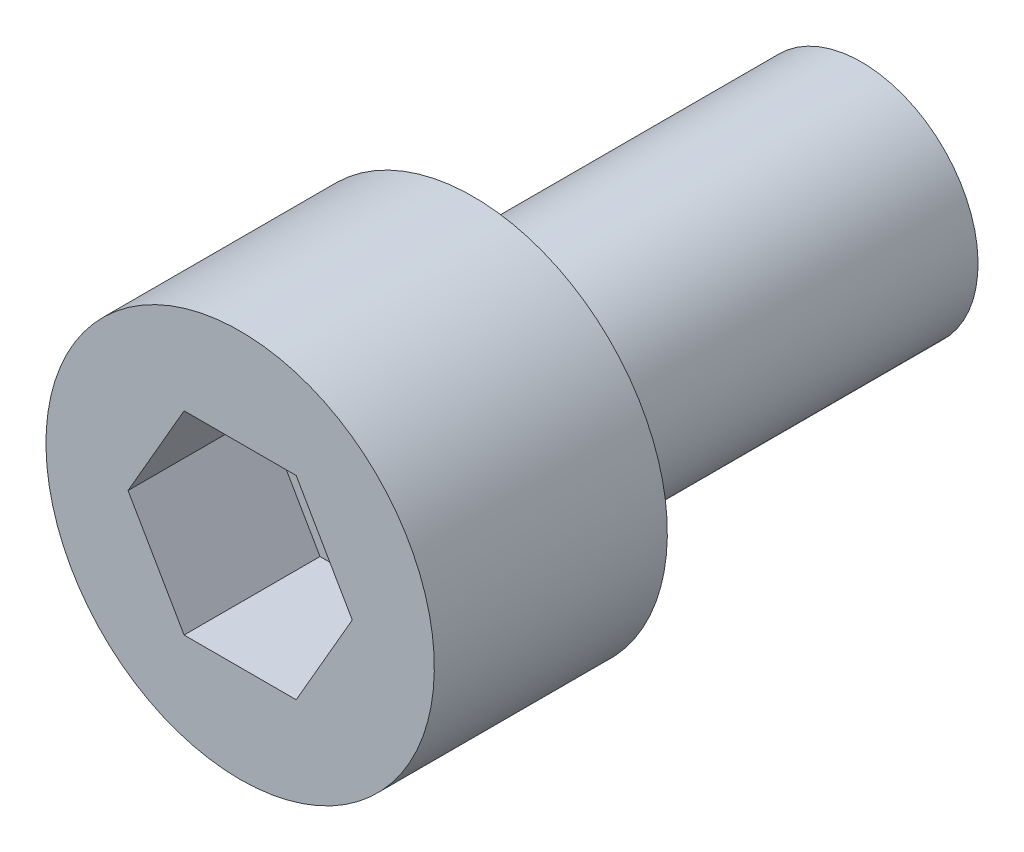
ISO-10303-21;
HEADER;
FILE_DESCRIPTION(('STEP AP214'),'2;1');
FILE_NAME('part.step','',(''),(''),'','','');
FILE_SCHEMA(('AUTOMOTIVE_DESIGN { 1 0 10303 214 1 1 1 1 }'));
ENDSEC;
DATA;
#1=APPLICATION_CONTEXT('core data for automotive mechanical design processes');
#2=APPLICATION_PROTOCOL_DEFINITION('international standard','automotive_design',2000,#1);
#3=PRODUCT_CONTEXT('',#1,'mechanical');
#4=PRODUCT('Part','Part','',(#3));
#5=PRODUCT_RELATED_PRODUCT_CATEGORY('part','',(#4));
#6=PRODUCT_DEFINITION_FORMATION('','',#4);
#7=PRODUCT_DEFINITION_CONTEXT('part definition',#1,'design');
#8=PRODUCT_DEFINITION('design','',#6,#7);
#9=PRODUCT_DEFINITION_SHAPE('','',#8);
#10=(LENGTH_UNIT() NAMED_UNIT(*) SI_UNIT(.MILLI.,.METRE.));
#11=(NAMED_UNIT(*) PLANE_ANGLE_UNIT() SI_UNIT($,.RADIAN.));
#12=(NAMED_UNIT(*) SI_UNIT($,.STERADIAN.) SOLID_ANGLE_UNIT());
#13=UNCERTAINTY_MEASURE_WITH_UNIT(LENGTH_MEASURE(1.E-05),#10,'distance_accuracy_value','');
#14=(GEOMETRIC_REPRESENTATION_CONTEXT(3) GLOBAL_UNCERTAINTY_ASSIGNED_CONTEXT((#13)) GLOBAL_UNIT_ASSIGNED_CONTEXT((#10,
#11,#12)) REPRESENTATION_CONTEXT('',''));
#15=CARTESIAN_POINT('',(0.,0.,0.));
#16=DIRECTION('',(0.,0.,1.));
#17=DIRECTION('',(1.,0.,0.));
#18=AXIS2_PLACEMENT_3D('',#15,#16,#17);
#19=CARTESIAN_POINT('',(0.,0.,6.));
#20=DIRECTION('',(0.,0.,-1.));
#21=DIRECTION('',(0.,1.,0.));
#22=AXIS2_PLACEMENT_3D('',#19,#20,#21);
#23=PLANE('',#22);
#24=DIRECTION('',(0.5,0.866025403784439,0.));
#25=VECTOR('',#24,1.);
#26=CARTESIAN_POINT('',(1.44337567297407,-2.5,6.));
#27=LINE('',#26,#25);
#28=CARTESIAN_POINT('',(1.44337567297407,-2.5,6.));
#29=VERTEX_POINT('',#28);
#30=CARTESIAN_POINT('',(2.88675134594813,0.,6.));
#31=VERTEX_POINT('',#30);
#32=EDGE_CURVE('E124',#29,#31,#27,.T.);
#33=ORIENTED_EDGE('',*,*,#32,.F.);
#34=DIRECTION('',(1.,0.,0.));
#35=VECTOR('',#34,1.);
#36=CARTESIAN_POINT('',(-1.44337567297406,-2.5,6.));
#37=LINE('',#36,#35);
#38=CARTESIAN_POINT('',(-1.44337567297406,-2.5,6.));
#39=VERTEX_POINT('',#38);
#40=EDGE_CURVE('E50',#39,#29,#37,.T.);
#41=ORIENTED_EDGE('',*,*,#40,.F.);
#42=DIRECTION('',(0.5,-0.866025403784439,0.));
#43=VECTOR('',#42,1.);
#44=CARTESIAN_POINT('',(-2.88675134594813,0.,6.));
#45=LINE('',#44,#43);
#46=CARTESIAN_POINT('',(-2.88675134594813,0.,6.));
#47=VERTEX_POINT('',#46);
#48=EDGE_CURVE('E133',#47,#39,#45,.T.);
#49=ORIENTED_EDGE('',*,*,#48,.F.);
#50=DIRECTION('',(-0.5,-0.866025403784439,0.));
#51=VECTOR('',#50,1.);
#52=CARTESIAN_POINT('',(-1.44337567297406,2.5,6.));
#53=LINE('',#52,#51);
#54=CARTESIAN_POINT('',(-1.44337567297406,2.5,6.));
#55=VERTEX_POINT('',#54);
#56=EDGE_CURVE('E131',#55,#47,#53,.T.);
#57=ORIENTED_EDGE('',*,*,#56,.F.);
#58=DIRECTION('',(-1.,0.,0.));
#59=VECTOR('',#58,1.);
#60=CARTESIAN_POINT('',(1.44337567297406,2.5,6.));
#61=LINE('',#60,#59);
#62=CARTESIAN_POINT('',(1.44337567297406,2.5,6.));
#63=VERTEX_POINT('',#62);
#64=EDGE_CURVE('E98',#63,#55,#61,.T.);
#65=ORIENTED_EDGE('',*,*,#64,.F.);
#66=DIRECTION('',(-0.5,0.866025403784439,0.));
#67=VECTOR('',#66,1.);
#68=CARTESIAN_POINT('',(2.88675134594813,0.,6.));
#69=LINE('',#68,#67);
#70=EDGE_CURVE('E127',#31,#63,#69,.T.);
#71=ORIENTED_EDGE('',*,*,#70,.F.);
#72=EDGE_LOOP('',(#33,#41,#49,#57,#65,#71));
#73=FACE_BOUND('',#72,.T.);
#74=CARTESIAN_POINT('',(0.,0.,6.));
#75=DIRECTION('',(0.,0.,1.));
#76=DIRECTION('',(0.,-1.,0.));
#77=AXIS2_PLACEMENT_3D('',#74,#75,#76);
#78=CIRCLE('',#77,5.);
#79=CARTESIAN_POINT('',(0.,-5.,6.));
#80=VERTEX_POINT('',#79);
#81=EDGE_CURVE('E11',#80,#80,#78,.T.);
#82=ORIENTED_EDGE('',*,*,#81,.T.);
#83=EDGE_LOOP('',(#82));
#84=FACE_BOUND('',#83,.T.);
#85=ADVANCED_FACE('F36',(#73,#84),#23,.F.);
#86=CARTESIAN_POINT('',(0.,0.,5.58488227818494));
#87=DIRECTION('',(0.,0.,1.));
#88=DIRECTION('',(0.,-1.,0.));
#89=AXIS2_PLACEMENT_3D('',#86,#87,#88);
#90=CYLINDRICAL_SURFACE('',#89,5.);
#91=ORIENTED_EDGE('',*,*,#81,.F.);
#92=EDGE_LOOP('',(#91));
#93=FACE_BOUND('',#92,.T.);
#94=CARTESIAN_POINT('',(0.,0.,0.));
#95=DIRECTION('',(0.,0.,1.));
#96=DIRECTION('',(0.,-1.,0.));
#97=AXIS2_PLACEMENT_3D('',#94,#95,#96);
#98=CIRCLE('',#97,5.);
#99=CARTESIAN_POINT('',(0.,-5.,0.));
#100=VERTEX_POINT('',#99);
#101=EDGE_CURVE('E43',#100,#100,#98,.T.);
#102=ORIENTED_EDGE('',*,*,#101,.T.);
#103=EDGE_LOOP('',(#102));
#104=FACE_BOUND('',#103,.T.);
#105=ADVANCED_FACE('F150',(#93,#104),#90,.T.);
#106=CARTESIAN_POINT('',(0.,5.,0.));
#107=DIRECTION('',(0.,0.,1.));
#108=DIRECTION('',(0.,-1.,0.));
#109=AXIS2_PLACEMENT_3D('',#106,#107,#108);
#110=PLANE('',#109);
#111=ORIENTED_EDGE('',*,*,#101,.F.);
#112=EDGE_LOOP('',(#111));
#113=FACE_BOUND('',#112,.T.);
#114=CARTESIAN_POINT('',(0.,0.,0.));
#115=DIRECTION('',(0.,0.,1.));
#116=DIRECTION('',(0.,-1.,0.));
#117=AXIS2_PLACEMENT_3D('',#114,#115,#116);
#118=CIRCLE('',#117,3.);
#119=CARTESIAN_POINT('',(0.,-3.,0.));
#120=VERTEX_POINT('',#119);
#121=EDGE_CURVE('E145',#120,#120,#118,.T.);
#122=ORIENTED_EDGE('',*,*,#121,.T.);
#123=EDGE_LOOP('',(#122));
#124=FACE_BOUND('',#123,.T.);
#125=ADVANCED_FACE('F152',(#113,#124),#110,.F.);
#126=CARTESIAN_POINT('',(0.,0.,5.58488227818494));
#127=DIRECTION('',(0.,0.,1.));
#128=DIRECTION('',(0.,-1.,0.));
#129=AXIS2_PLACEMENT_3D('',#126,#127,#128);
#130=CYLINDRICAL_SURFACE('',#129,3.);
#131=ORIENTED_EDGE('',*,*,#121,.F.);
#132=EDGE_LOOP('',(#131));
#133=FACE_BOUND('',#132,.T.);
#134=CARTESIAN_POINT('',(0.,0.,-10.));
#135=DIRECTION('',(0.,0.,1.));
#136=DIRECTION('',(0.,-1.,0.));
#137=AXIS2_PLACEMENT_3D('',#134,#135,#136);
#138=CIRCLE('',#137,3.);
#139=CARTESIAN_POINT('',(0.,-3.,-10.));
#140=VERTEX_POINT('',#139);
#141=EDGE_CURVE('E137',#140,#140,#138,.T.);
#142=ORIENTED_EDGE('',*,*,#141,.T.);
#143=EDGE_LOOP('',(#142));
#144=FACE_BOUND('',#143,.T.);
#145=ADVANCED_FACE('F155',(#133,#144),#130,.T.);
#146=CARTESIAN_POINT('',(0.,3.,-10.));
#147=DIRECTION('',(0.,0.,1.));
#148=DIRECTION('',(0.,-1.,0.));
#149=AXIS2_PLACEMENT_3D('',#146,#147,#148);
#150=PLANE('',#149);
#151=ORIENTED_EDGE('',*,*,#141,.F.);
#152=EDGE_LOOP('',(#151));
#153=FACE_BOUND('',#152,.T.);
#154=ADVANCED_FACE('F161',(#153),#150,.F.);
#155=CARTESIAN_POINT('',(-1.44337567297406,-2.5,2.5));
#156=DIRECTION('',(0.,-1.,0.));
#157=DIRECTION('',(1.,0.,0.));
#158=AXIS2_PLACEMENT_3D('',#155,#156,#157);
#159=PLANE('',#158);
#160=ORIENTED_EDGE('',*,*,#40,.T.);
#161=DIRECTION('',(0.,0.,1.));
#162=VECTOR('',#161,1.);
#163=CARTESIAN_POINT('',(1.44337567297407,-2.5,2.5));
#164=LINE('',#163,#162);
#165=CARTESIAN_POINT('',(1.44337567297407,-2.5,2.5));
#166=VERTEX_POINT('',#165);
#167=EDGE_CURVE('E80',#166,#29,#164,.T.);
#168=ORIENTED_EDGE('',*,*,#167,.F.);
#169=DIRECTION('',(1.,0.,0.));
#170=VECTOR('',#169,1.);
#171=CARTESIAN_POINT('',(-1.44337567297406,-2.5,2.5));
#172=LINE('',#171,#170);
#173=CARTESIAN_POINT('',(-1.44337567297406,-2.5,2.5));
#174=VERTEX_POINT('',#173);
#175=EDGE_CURVE('E135',#174,#166,#172,.T.);
#176=ORIENTED_EDGE('',*,*,#175,.F.);
#177=DIRECTION('',(0.,0.,1.));
#178=VECTOR('',#177,1.);
#179=CARTESIAN_POINT('',(-1.44337567297406,-2.5,2.5));
#180=LINE('',#179,#178);
#181=EDGE_CURVE('E58',#174,#39,#180,.T.);
#182=ORIENTED_EDGE('',*,*,#181,.T.);
#183=EDGE_LOOP('',(#160,#168,#176,#182));
#184=FACE_BOUND('',#183,.T.);
#185=ADVANCED_FACE('F166',(#184),#159,.F.);
#186=CARTESIAN_POINT('',(-2.88675134594813,0.,2.5));
#187=DIRECTION('',(-0.866025403784439,-0.5,0.));
#188=DIRECTION('',(0.5,-0.866025403784439,0.));
#189=AXIS2_PLACEMENT_3D('',#186,#187,#188);
#190=PLANE('',#189);
#191=ORIENTED_EDGE('',*,*,#48,.T.);
#192=ORIENTED_EDGE('',*,*,#181,.F.);
#193=DIRECTION('',(0.5,-0.866025403784439,0.));
#194=VECTOR('',#193,1.);
#195=CARTESIAN_POINT('',(-2.88675134594813,0.,2.5));
#196=LINE('',#195,#194);
#197=CARTESIAN_POINT('',(-2.88675134594813,0.,2.5));
#198=VERTEX_POINT('',#197);
#199=EDGE_CURVE('E110',#198,#174,#196,.T.);
#200=ORIENTED_EDGE('',*,*,#199,.F.);
#201=DIRECTION('',(0.,0.,1.));
#202=VECTOR('',#201,1.);
#203=CARTESIAN_POINT('',(-2.88675134594813,0.,2.5));
#204=LINE('',#203,#202);
#205=EDGE_CURVE('E102',#198,#47,#204,.T.);
#206=ORIENTED_EDGE('',*,*,#205,.T.);
#207=EDGE_LOOP('',(#191,#192,#200,#206));
#208=FACE_BOUND('',#207,.T.);
#209=ADVANCED_FACE('F171',(#208),#190,.F.);
#210=CARTESIAN_POINT('',(-1.44337567297406,2.5,2.5));
#211=DIRECTION('',(-0.866025403784439,0.5,0.));
#212=DIRECTION('',(-0.5,-0.866025403784439,0.));
#213=AXIS2_PLACEMENT_3D('',#210,#211,#212);
#214=PLANE('',#213);
#215=ORIENTED_EDGE('',*,*,#56,.T.);
#216=ORIENTED_EDGE('',*,*,#205,.F.);
#217=DIRECTION('',(-0.5,-0.866025403784439,0.));
#218=VECTOR('',#217,1.);
#219=CARTESIAN_POINT('',(-1.44337567297406,2.5,2.5));
#220=LINE('',#219,#218);
#221=CARTESIAN_POINT('',(-1.44337567297406,2.5,2.5));
#222=VERTEX_POINT('',#221);
#223=EDGE_CURVE('E106',#222,#198,#220,.T.);
#224=ORIENTED_EDGE('',*,*,#223,.F.);
#225=DIRECTION('',(0.,0.,1.));
#226=VECTOR('',#225,1.);
#227=CARTESIAN_POINT('',(-1.44337567297406,2.5,2.5));
#228=LINE('',#227,#226);
#229=EDGE_CURVE('E91',#222,#55,#228,.T.);
#230=ORIENTED_EDGE('',*,*,#229,.T.);
#231=EDGE_LOOP('',(#215,#216,#224,#230));
#232=FACE_BOUND('',#231,.T.);
#233=ADVANCED_FACE('F107',(#232),#214,.F.);
#234=CARTESIAN_POINT('',(1.44337567297406,2.5,2.5));
#235=DIRECTION('',(0.,1.,0.));
#236=DIRECTION('',(0.,0.,1.));
#237=AXIS2_PLACEMENT_3D('',#234,#235,#236);
#238=PLANE('',#237);
#239=ORIENTED_EDGE('',*,*,#64,.T.);
#240=ORIENTED_EDGE('',*,*,#229,.F.);
#241=DIRECTION('',(-1.,0.,0.));
#242=VECTOR('',#241,1.);
#243=CARTESIAN_POINT('',(1.44337567297406,2.5,2.5));
#244=LINE('',#243,#242);
#245=CARTESIAN_POINT('',(1.44337567297406,2.5,2.5));
#246=VERTEX_POINT('',#245);
#247=EDGE_CURVE('E95',#246,#222,#244,.T.);
#248=ORIENTED_EDGE('',*,*,#247,.F.);
#249=DIRECTION('',(0.,0.,1.));
#250=VECTOR('',#249,1.);
#251=CARTESIAN_POINT('',(1.44337567297406,2.5,2.5));
#252=LINE('',#251,#250);
#253=EDGE_CURVE('E103',#246,#63,#252,.T.);
#254=ORIENTED_EDGE('',*,*,#253,.T.);
#255=EDGE_LOOP('',(#239,#240,#248,#254));
#256=FACE_BOUND('',#255,.T.);
#257=ADVANCED_FACE('F93',(#256),#238,.F.);
#258=CARTESIAN_POINT('',(2.88675134594813,0.,2.5));
#259=DIRECTION('',(0.866025403784439,0.5,0.));
#260=DIRECTION('',(-0.5,0.866025403784439,0.));
#261=AXIS2_PLACEMENT_3D('',#258,#259,#260);
#262=PLANE('',#261);
#263=ORIENTED_EDGE('',*,*,#70,.T.);
#264=ORIENTED_EDGE('',*,*,#253,.F.);
#265=DIRECTION('',(-0.5,0.866025403784439,0.));
#266=VECTOR('',#265,1.);
#267=CARTESIAN_POINT('',(2.88675134594813,0.,2.5));
#268=LINE('',#267,#266);
#269=CARTESIAN_POINT('',(2.88675134594813,0.,2.5));
#270=VERTEX_POINT('',#269);
#271=EDGE_CURVE('E116',#270,#246,#268,.T.);
#272=ORIENTED_EDGE('',*,*,#271,.F.);
#273=DIRECTION('',(0.,0.,1.));
#274=VECTOR('',#273,1.);
#275=CARTESIAN_POINT('',(2.88675134594813,0.,2.5));
#276=LINE('',#275,#274);
#277=EDGE_CURVE('E140',#270,#31,#276,.T.);
#278=ORIENTED_EDGE('',*,*,#277,.T.);
#279=EDGE_LOOP('',(#263,#264,#272,#278));
#280=FACE_BOUND('',#279,.T.);
#281=ADVANCED_FACE('F197',(#280),#262,.F.);
#282=CARTESIAN_POINT('',(1.44337567297407,-2.5,2.5));
#283=DIRECTION('',(0.866025403784439,-0.5,0.));
#284=DIRECTION('',(0.5,0.866025403784439,0.));
#285=AXIS2_PLACEMENT_3D('',#282,#283,#284);
#286=PLANE('',#285);
#287=ORIENTED_EDGE('',*,*,#32,.T.);
#288=ORIENTED_EDGE('',*,*,#277,.F.);
#289=DIRECTION('',(0.5,0.866025403784439,0.));
#290=VECTOR('',#289,1.);
#291=CARTESIAN_POINT('',(1.44337567297407,-2.5,2.5));
#292=LINE('',#291,#290);
#293=EDGE_CURVE('E118',#166,#270,#292,.T.);
#294=ORIENTED_EDGE('',*,*,#293,.F.);
#295=ORIENTED_EDGE('',*,*,#167,.T.);
#296=EDGE_LOOP('',(#287,#288,#294,#295));
#297=FACE_BOUND('',#296,.T.);
#298=ADVANCED_FACE('F185',(#297),#286,.F.);
#299=CARTESIAN_POINT('',(-1.44337567297406,-2.5,2.5));
#300=DIRECTION('',(0.,0.,-1.));
#301=DIRECTION('',(-1.,0.,0.));
#302=AXIS2_PLACEMENT_3D('',#299,#300,#301);
#303=PLANE('',#302);
#304=ORIENTED_EDGE('',*,*,#175,.T.);
#305=ORIENTED_EDGE('',*,*,#293,.T.);
#306=ORIENTED_EDGE('',*,*,#271,.T.);
#307=ORIENTED_EDGE('',*,*,#247,.T.);
#308=ORIENTED_EDGE('',*,*,#223,.T.);
#309=ORIENTED_EDGE('',*,*,#199,.T.);
#310=EDGE_LOOP('',(#304,#305,#306,#307,#308,#309));
#311=FACE_BOUND('',#310,.T.);
#312=ADVANCED_FACE('F113',(#311),#303,.F.);
#313=CLOSED_SHELL('',(#85,#105,#125,#145,#154,#185,#209,#233,#257,#281,#298,#312));
#314=MANIFOLD_SOLID_BREP('B2',#313);
#315=ADVANCED_BREP_SHAPE_REPRESENTATION('',(#18,#314),#14);
#316=SHAPE_DEFINITION_REPRESENTATION(#9,#315);
ENDSEC;
END-ISO-10303-21;
